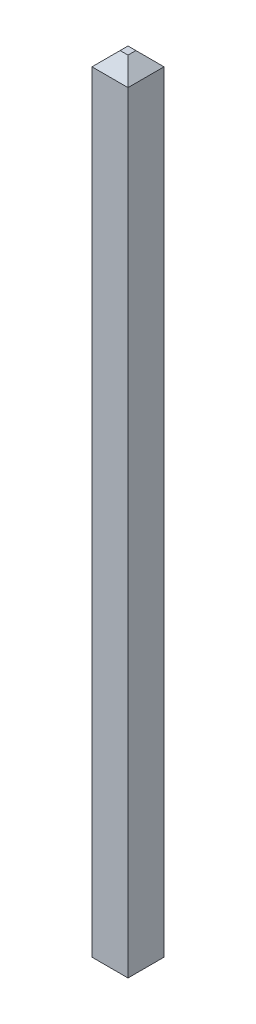
ISO-10303-21;
HEADER;
FILE_DESCRIPTION(('STEP AP214'),'2;1');
FILE_NAME('part.step','',(''),(''),'','','');
FILE_SCHEMA(('AUTOMOTIVE_DESIGN { 1 0 10303 214 1 1 1 1 }'));
ENDSEC;
DATA;
#1=APPLICATION_CONTEXT('core data for automotive mechanical design processes');
#2=APPLICATION_PROTOCOL_DEFINITION('international standard','automotive_design',2000,#1);
#3=PRODUCT_CONTEXT('',#1,'mechanical');
#4=PRODUCT('Part','Part','',(#3));
#5=PRODUCT_RELATED_PRODUCT_CATEGORY('part','',(#4));
#6=PRODUCT_DEFINITION_FORMATION('','',#4);
#7=PRODUCT_DEFINITION_CONTEXT('part definition',#1,'design');
#8=PRODUCT_DEFINITION('design','',#6,#7);
#9=PRODUCT_DEFINITION_SHAPE('','',#8);
#10=(LENGTH_UNIT() NAMED_UNIT(*) SI_UNIT(.MILLI.,.METRE.));
#11=(NAMED_UNIT(*) PLANE_ANGLE_UNIT() SI_UNIT($,.RADIAN.));
#12=(NAMED_UNIT(*) SI_UNIT($,.STERADIAN.) SOLID_ANGLE_UNIT());
#13=UNCERTAINTY_MEASURE_WITH_UNIT(LENGTH_MEASURE(1.E-05),#10,'distance_accuracy_value','');
#14=(GEOMETRIC_REPRESENTATION_CONTEXT(3) GLOBAL_UNCERTAINTY_ASSIGNED_CONTEXT((#13)) GLOBAL_UNIT_ASSIGNED_CONTEXT((#10,
#11,#12)) REPRESENTATION_CONTEXT('',''));
#15=CARTESIAN_POINT('',(0.,0.,0.));
#16=DIRECTION('',(0.,0.,1.));
#17=DIRECTION('',(1.,0.,0.));
#18=AXIS2_PLACEMENT_3D('',#15,#16,#17);
#19=CARTESIAN_POINT('',(-0.32,14.2,-0.32));
#20=DIRECTION('',(1.,0.,0.));
#21=DIRECTION('',(0.,0.,-1.));
#22=AXIS2_PLACEMENT_3D('',#19,#20,#21);
#23=PLANE('',#22);
#24=DIRECTION('',(0.,-1.,0.));
#25=VECTOR('',#24,1.);
#26=CARTESIAN_POINT('',(-0.32,14.2,-0.32));
#27=LINE('',#26,#25);
#28=CARTESIAN_POINT('',(-0.32,13.95,-0.32));
#29=VERTEX_POINT('',#28);
#30=CARTESIAN_POINT('',(-0.32,0.250000000000002,-0.32));
#31=VERTEX_POINT('',#30);
#32=EDGE_CURVE('E102',#29,#31,#27,.T.);
#33=ORIENTED_EDGE('',*,*,#32,.T.);
#34=DIRECTION('',(0.,0.,1.));
#35=VECTOR('',#34,1.);
#36=CARTESIAN_POINT('',(-0.32,0.250000000000002,-0.32));
#37=LINE('',#36,#35);
#38=CARTESIAN_POINT('',(-0.32,0.250000000000002,0.32));
#39=VERTEX_POINT('',#38);
#40=EDGE_CURVE('E41',#31,#39,#37,.T.);
#41=ORIENTED_EDGE('',*,*,#40,.T.);
#42=DIRECTION('',(0.,-1.,0.));
#43=VECTOR('',#42,1.);
#44=CARTESIAN_POINT('',(-0.32,14.2,0.32));
#45=LINE('',#44,#43);
#46=CARTESIAN_POINT('',(-0.32,13.95,0.32));
#47=VERTEX_POINT('',#46);
#48=EDGE_CURVE('E135',#47,#39,#45,.T.);
#49=ORIENTED_EDGE('',*,*,#48,.F.);
#50=DIRECTION('',(0.,0.,-1.));
#51=VECTOR('',#50,1.);
#52=CARTESIAN_POINT('',(-0.32,13.95,-0.32));
#53=LINE('',#52,#51);
#54=EDGE_CURVE('E108',#47,#29,#53,.T.);
#55=ORIENTED_EDGE('',*,*,#54,.T.);
#56=EDGE_LOOP('',(#33,#41,#49,#55));
#57=FACE_BOUND('',#56,.T.);
#58=ADVANCED_FACE('F32',(#57),#23,.F.);
#59=CARTESIAN_POINT('',(-0.32,14.2,0.32));
#60=DIRECTION('',(0.,0.,-1.));
#61=DIRECTION('',(-1.,0.,0.));
#62=AXIS2_PLACEMENT_3D('',#59,#60,#61);
#63=PLANE('',#62);
#64=ORIENTED_EDGE('',*,*,#48,.T.);
#65=DIRECTION('',(1.,0.,0.));
#66=VECTOR('',#65,1.);
#67=CARTESIAN_POINT('',(-0.32,0.250000000000002,0.32));
#68=LINE('',#67,#66);
#69=CARTESIAN_POINT('',(0.32,0.250000000000002,0.32));
#70=VERTEX_POINT('',#69);
#71=EDGE_CURVE('E11',#39,#70,#68,.T.);
#72=ORIENTED_EDGE('',*,*,#71,.T.);
#73=DIRECTION('',(0.,-1.,0.));
#74=VECTOR('',#73,1.);
#75=CARTESIAN_POINT('',(0.32,14.2,0.32));
#76=LINE('',#75,#74);
#77=CARTESIAN_POINT('',(0.32,13.95,0.32));
#78=VERTEX_POINT('',#77);
#79=EDGE_CURVE('E120',#78,#70,#76,.T.);
#80=ORIENTED_EDGE('',*,*,#79,.F.);
#81=DIRECTION('',(-1.,0.,0.));
#82=VECTOR('',#81,1.);
#83=CARTESIAN_POINT('',(-0.32,13.95,0.32));
#84=LINE('',#83,#82);
#85=EDGE_CURVE('E147',#78,#47,#84,.T.);
#86=ORIENTED_EDGE('',*,*,#85,.T.);
#87=EDGE_LOOP('',(#64,#72,#80,#86));
#88=FACE_BOUND('',#87,.T.);
#89=ADVANCED_FACE('F186',(#88),#63,.F.);
#90=CARTESIAN_POINT('',(0.32,14.2,-0.32));
#91=DIRECTION('',(1.,0.,0.));
#92=DIRECTION('',(0.,0.,-1.));
#93=AXIS2_PLACEMENT_3D('',#90,#91,#92);
#94=PLANE('',#93);
#95=ORIENTED_EDGE('',*,*,#79,.T.);
#96=DIRECTION('',(0.,0.,-1.));
#97=VECTOR('',#96,1.);
#98=CARTESIAN_POINT('',(0.32,0.250000000000002,-0.32));
#99=LINE('',#98,#97);
#100=CARTESIAN_POINT('',(0.32,0.250000000000002,-0.32));
#101=VERTEX_POINT('',#100);
#102=EDGE_CURVE('E119',#70,#101,#99,.T.);
#103=ORIENTED_EDGE('',*,*,#102,.T.);
#104=DIRECTION('',(0.,-1.,0.));
#105=VECTOR('',#104,1.);
#106=CARTESIAN_POINT('',(0.32,14.2,-0.32));
#107=LINE('',#106,#105);
#108=CARTESIAN_POINT('',(0.32,13.95,-0.32));
#109=VERTEX_POINT('',#108);
#110=EDGE_CURVE('E101',#109,#101,#107,.T.);
#111=ORIENTED_EDGE('',*,*,#110,.F.);
#112=DIRECTION('',(0.,0.,1.));
#113=VECTOR('',#112,1.);
#114=CARTESIAN_POINT('',(0.32,13.95,-0.32));
#115=LINE('',#114,#113);
#116=EDGE_CURVE('E116',#109,#78,#115,.T.);
#117=ORIENTED_EDGE('',*,*,#116,.T.);
#118=EDGE_LOOP('',(#95,#103,#111,#117));
#119=FACE_BOUND('',#118,.T.);
#120=ADVANCED_FACE('F114',(#119),#94,.T.);
#121=CARTESIAN_POINT('',(-0.32,14.2,-0.32));
#122=DIRECTION('',(0.,0.,-1.));
#123=DIRECTION('',(-1.,0.,0.));
#124=AXIS2_PLACEMENT_3D('',#121,#122,#123);
#125=PLANE('',#124);
#126=ORIENTED_EDGE('',*,*,#110,.T.);
#127=DIRECTION('',(-1.,0.,0.));
#128=VECTOR('',#127,1.);
#129=CARTESIAN_POINT('',(-0.32,0.250000000000002,-0.32));
#130=LINE('',#129,#128);
#131=EDGE_CURVE('E56',#101,#31,#130,.T.);
#132=ORIENTED_EDGE('',*,*,#131,.T.);
#133=ORIENTED_EDGE('',*,*,#32,.F.);
#134=DIRECTION('',(1.,0.,0.));
#135=VECTOR('',#134,1.);
#136=CARTESIAN_POINT('',(-0.32,13.95,-0.32));
#137=LINE('',#136,#135);
#138=EDGE_CURVE('E98',#29,#109,#137,.T.);
#139=ORIENTED_EDGE('',*,*,#138,.T.);
#140=EDGE_LOOP('',(#126,#132,#133,#139));
#141=FACE_BOUND('',#140,.T.);
#142=ADVANCED_FACE('F100',(#141),#125,.T.);
#143=CARTESIAN_POINT('',(0.,14.2,0.));
#144=DIRECTION('',(0.,1.,0.));
#145=DIRECTION('',(0.,0.,1.));
#146=AXIS2_PLACEMENT_3D('',#143,#144,#145);
#147=PLANE('',#146);
#148=DIRECTION('',(1.,0.,0.));
#149=VECTOR('',#148,1.);
#150=CARTESIAN_POINT('',(0.32,14.2,0.069999999999998));
#151=LINE('',#150,#149);
#152=CARTESIAN_POINT('',(-0.0699999999999976,14.2,0.069999999999998));
#153=VERTEX_POINT('',#152);
#154=CARTESIAN_POINT('',(0.0699999999999985,14.2,0.069999999999998));
#155=VERTEX_POINT('',#154);
#156=EDGE_CURVE('E143',#153,#155,#151,.T.);
#157=ORIENTED_EDGE('',*,*,#156,.T.);
#158=DIRECTION('',(0.,0.,-1.));
#159=VECTOR('',#158,1.);
#160=CARTESIAN_POINT('',(0.0699999999999985,14.2,0.));
#161=LINE('',#160,#159);
#162=CARTESIAN_POINT('',(0.0699999999999985,14.2,-0.069999999999998));
#163=VERTEX_POINT('',#162);
#164=EDGE_CURVE('E145',#155,#163,#161,.T.);
#165=ORIENTED_EDGE('',*,*,#164,.T.);
#166=DIRECTION('',(-1.,0.,0.));
#167=VECTOR('',#166,1.);
#168=CARTESIAN_POINT('',(0.,14.2,-0.069999999999998));
#169=LINE('',#168,#167);
#170=CARTESIAN_POINT('',(-0.0699999999999976,14.2,-0.069999999999998));
#171=VERTEX_POINT('',#170);
#172=EDGE_CURVE('E125',#163,#171,#169,.T.);
#173=ORIENTED_EDGE('',*,*,#172,.T.);
#174=DIRECTION('',(0.,0.,1.));
#175=VECTOR('',#174,1.);
#176=CARTESIAN_POINT('',(-0.0699999999999976,14.2,0.32));
#177=LINE('',#176,#175);
#178=EDGE_CURVE('E137',#171,#153,#177,.T.);
#179=ORIENTED_EDGE('',*,*,#178,.T.);
#180=EDGE_LOOP('',(#157,#165,#173,#179));
#181=FACE_BOUND('',#180,.T.);
#182=ADVANCED_FACE('F194',(#181),#147,.T.);
#183=CARTESIAN_POINT('',(0.,0.,0.));
#184=DIRECTION('',(0.,1.,0.));
#185=DIRECTION('',(0.,0.,1.));
#186=AXIS2_PLACEMENT_3D('',#183,#184,#185);
#187=PLANE('',#186);
#188=DIRECTION('',(1.,0.,0.));
#189=VECTOR('',#188,1.);
#190=CARTESIAN_POINT('',(0.32,0.,-0.069999999999998));
#191=LINE('',#190,#189);
#192=CARTESIAN_POINT('',(-0.0699999999999976,0.,-0.069999999999998));
#193=VERTEX_POINT('',#192);
#194=CARTESIAN_POINT('',(0.0699999999999985,0.,-0.069999999999998));
#195=VERTEX_POINT('',#194);
#196=EDGE_CURVE('E158',#193,#195,#191,.T.);
#197=ORIENTED_EDGE('',*,*,#196,.T.);
#198=DIRECTION('',(0.,0.,1.));
#199=VECTOR('',#198,1.);
#200=CARTESIAN_POINT('',(0.0699999999999985,0.,0.32));
#201=LINE('',#200,#199);
#202=CARTESIAN_POINT('',(0.0699999999999985,0.,0.069999999999998));
#203=VERTEX_POINT('',#202);
#204=EDGE_CURVE('E160',#195,#203,#201,.T.);
#205=ORIENTED_EDGE('',*,*,#204,.T.);
#206=DIRECTION('',(-1.,0.,0.));
#207=VECTOR('',#206,1.);
#208=CARTESIAN_POINT('',(0.,0.,0.069999999999998));
#209=LINE('',#208,#207);
#210=CARTESIAN_POINT('',(-0.0699999999999976,0.,0.069999999999998));
#211=VERTEX_POINT('',#210);
#212=EDGE_CURVE('E107',#203,#211,#209,.T.);
#213=ORIENTED_EDGE('',*,*,#212,.T.);
#214=DIRECTION('',(0.,0.,-1.));
#215=VECTOR('',#214,1.);
#216=CARTESIAN_POINT('',(-0.0699999999999976,0.,0.));
#217=LINE('',#216,#215);
#218=EDGE_CURVE('E156',#211,#193,#217,.T.);
#219=ORIENTED_EDGE('',*,*,#218,.T.);
#220=EDGE_LOOP('',(#197,#205,#213,#219));
#221=FACE_BOUND('',#220,.T.);
#222=ADVANCED_FACE('F191',(#221),#187,.F.);
#223=CARTESIAN_POINT('',(-0.0699999999999976,14.2,0.));
#224=DIRECTION('',(-0.707106781186545,0.70710678118655,0.));
#225=DIRECTION('',(0.,0.,-1.));
#226=AXIS2_PLACEMENT_3D('',#223,#224,#225);
#227=PLANE('',#226);
#228=DIRECTION('',(0.577350269189627,0.577350269189623,-0.577350269189627));
#229=VECTOR('',#228,1.);
#230=CARTESIAN_POINT('',(-0.0466666666666648,14.2233333333333,0.0466666666666652));
#231=LINE('',#230,#229);
#232=EDGE_CURVE('E129',#153,#47,#231,.F.);
#233=ORIENTED_EDGE('',*,*,#232,.F.);
#234=ORIENTED_EDGE('',*,*,#178,.F.);
#235=DIRECTION('',(-0.577350269189627,-0.577350269189623,-0.577350269189627));
#236=VECTOR('',#235,1.);
#237=CARTESIAN_POINT('',(-0.32,13.95,-0.32));
#238=LINE('',#237,#236);
#239=EDGE_CURVE('E153',#29,#171,#238,.F.);
#240=ORIENTED_EDGE('',*,*,#239,.F.);
#241=ORIENTED_EDGE('',*,*,#54,.F.);
#242=EDGE_LOOP('',(#233,#234,#240,#241));
#243=FACE_BOUND('',#242,.T.);
#244=ADVANCED_FACE('F193',(#243),#227,.T.);
#245=CARTESIAN_POINT('',(-0.32,13.95,-0.32));
#246=DIRECTION('',(0.,-0.70710678118655,0.707106781186545));
#247=DIRECTION('',(1.,0.,0.));
#248=AXIS2_PLACEMENT_3D('',#245,#246,#247);
#249=PLANE('',#248);
#250=ORIENTED_EDGE('',*,*,#239,.T.);
#251=ORIENTED_EDGE('',*,*,#172,.F.);
#252=DIRECTION('',(0.577350269189627,-0.577350269189623,-0.577350269189627));
#253=VECTOR('',#252,1.);
#254=CARTESIAN_POINT('',(0.106666666666666,14.1633333333333,-0.106666666666666));
#255=LINE('',#254,#253);
#256=EDGE_CURVE('E123',#109,#163,#255,.F.);
#257=ORIENTED_EDGE('',*,*,#256,.F.);
#258=ORIENTED_EDGE('',*,*,#138,.F.);
#259=EDGE_LOOP('',(#250,#251,#257,#258));
#260=FACE_BOUND('',#259,.T.);
#261=ADVANCED_FACE('F124',(#260),#249,.F.);
#262=CARTESIAN_POINT('',(0.,14.2,0.069999999999998));
#263=DIRECTION('',(0.,0.70710678118655,0.707106781186545));
#264=DIRECTION('',(-1.,0.,0.));
#265=AXIS2_PLACEMENT_3D('',#262,#263,#264);
#266=PLANE('',#265);
#267=ORIENTED_EDGE('',*,*,#232,.T.);
#268=ORIENTED_EDGE('',*,*,#85,.F.);
#269=DIRECTION('',(0.577350269189627,-0.577350269189623,0.577350269189627));
#270=VECTOR('',#269,1.);
#271=CARTESIAN_POINT('',(0.0466666666666655,14.2233333333333,0.0466666666666651));
#272=LINE('',#271,#270);
#273=EDGE_CURVE('E130',#155,#78,#272,.T.);
#274=ORIENTED_EDGE('',*,*,#273,.F.);
#275=ORIENTED_EDGE('',*,*,#156,.F.);
#276=EDGE_LOOP('',(#267,#268,#274,#275));
#277=FACE_BOUND('',#276,.T.);
#278=ADVANCED_FACE('F215',(#277),#266,.T.);
#279=CARTESIAN_POINT('',(0.32,13.95,-0.32));
#280=DIRECTION('',(-0.707106781186545,-0.70710678118655,0.));
#281=DIRECTION('',(0.,0.,1.));
#282=AXIS2_PLACEMENT_3D('',#279,#280,#281);
#283=PLANE('',#282);
#284=ORIENTED_EDGE('',*,*,#256,.T.);
#285=ORIENTED_EDGE('',*,*,#164,.F.);
#286=ORIENTED_EDGE('',*,*,#273,.T.);
#287=ORIENTED_EDGE('',*,*,#116,.F.);
#288=EDGE_LOOP('',(#284,#285,#286,#287));
#289=FACE_BOUND('',#288,.T.);
#290=ADVANCED_FACE('F132',(#289),#283,.F.);
#291=CARTESIAN_POINT('',(-0.32,0.250000000000002,-0.32));
#292=DIRECTION('',(0.707106781186547,0.707106781186547,0.));
#293=DIRECTION('',(0.,0.,1.));
#294=AXIS2_PLACEMENT_3D('',#291,#292,#293);
#295=PLANE('',#294);
#296=DIRECTION('',(0.577350269189626,-0.577350269189626,-0.577350269189626));
#297=VECTOR('',#296,1.);
#298=CARTESIAN_POINT('',(-0.32,0.250000000000002,0.32));
#299=LINE('',#298,#297);
#300=EDGE_CURVE('E169',#39,#211,#299,.T.);
#301=ORIENTED_EDGE('',*,*,#300,.F.);
#302=ORIENTED_EDGE('',*,*,#40,.F.);
#303=DIRECTION('',(-0.577350269189626,0.577350269189626,-0.577350269189626));
#304=VECTOR('',#303,1.);
#305=CARTESIAN_POINT('',(-0.32,0.250000000000002,-0.32));
#306=LINE('',#305,#304);
#307=EDGE_CURVE('E36',#193,#31,#306,.T.);
#308=ORIENTED_EDGE('',*,*,#307,.F.);
#309=ORIENTED_EDGE('',*,*,#218,.F.);
#310=EDGE_LOOP('',(#301,#302,#308,#309));
#311=FACE_BOUND('',#310,.T.);
#312=ADVANCED_FACE('F34',(#311),#295,.F.);
#313=CARTESIAN_POINT('',(0.,0.,-0.069999999999998));
#314=DIRECTION('',(0.,-0.707106781186547,-0.707106781186547));
#315=DIRECTION('',(-1.,0.,0.));
#316=AXIS2_PLACEMENT_3D('',#313,#314,#315);
#317=PLANE('',#316);
#318=ORIENTED_EDGE('',*,*,#307,.T.);
#319=ORIENTED_EDGE('',*,*,#131,.F.);
#320=DIRECTION('',(-0.577350269189626,-0.577350269189626,0.577350269189626));
#321=VECTOR('',#320,1.);
#322=CARTESIAN_POINT('',(0.0466666666666656,-0.0233333333333328,-0.0466666666666652));
#323=LINE('',#322,#321);
#324=EDGE_CURVE('E168',#195,#101,#323,.F.);
#325=ORIENTED_EDGE('',*,*,#324,.F.);
#326=ORIENTED_EDGE('',*,*,#196,.F.);
#327=EDGE_LOOP('',(#318,#319,#325,#326));
#328=FACE_BOUND('',#327,.T.);
#329=ADVANCED_FACE('F179',(#328),#317,.T.);
#330=CARTESIAN_POINT('',(-0.32,0.250000000000002,0.32));
#331=DIRECTION('',(0.,0.707106781186547,-0.707106781186547));
#332=DIRECTION('',(1.,0.,0.));
#333=AXIS2_PLACEMENT_3D('',#330,#331,#332);
#334=PLANE('',#333);
#335=ORIENTED_EDGE('',*,*,#300,.T.);
#336=ORIENTED_EDGE('',*,*,#212,.F.);
#337=DIRECTION('',(-0.577350269189626,-0.577350269189626,-0.577350269189626));
#338=VECTOR('',#337,1.);
#339=CARTESIAN_POINT('',(0.106666666666667,0.0366666666666686,0.106666666666667));
#340=LINE('',#339,#338);
#341=EDGE_CURVE('E166',#70,#203,#340,.T.);
#342=ORIENTED_EDGE('',*,*,#341,.F.);
#343=ORIENTED_EDGE('',*,*,#71,.F.);
#344=EDGE_LOOP('',(#335,#336,#342,#343));
#345=FACE_BOUND('',#344,.T.);
#346=ADVANCED_FACE('F184',(#345),#334,.F.);
#347=CARTESIAN_POINT('',(0.0699999999999985,0.,0.));
#348=DIRECTION('',(0.707106781186547,-0.707106781186547,0.));
#349=DIRECTION('',(0.,0.,-1.));
#350=AXIS2_PLACEMENT_3D('',#347,#348,#349);
#351=PLANE('',#350);
#352=ORIENTED_EDGE('',*,*,#324,.T.);
#353=ORIENTED_EDGE('',*,*,#102,.F.);
#354=ORIENTED_EDGE('',*,*,#341,.T.);
#355=ORIENTED_EDGE('',*,*,#204,.F.);
#356=EDGE_LOOP('',(#352,#353,#354,#355));
#357=FACE_BOUND('',#356,.T.);
#358=ADVANCED_FACE('F188',(#357),#351,.T.);
#359=CLOSED_SHELL('',(#58,#89,#120,#142,#182,#222,#244,#261,#278,#290,#312,#329,#346,#358));
#360=MANIFOLD_SOLID_BREP('B2',#359);
#361=ADVANCED_BREP_SHAPE_REPRESENTATION('',(#18,#360),#14);
#362=SHAPE_DEFINITION_REPRESENTATION(#9,#361);
ENDSEC;
END-ISO-10303-21;
